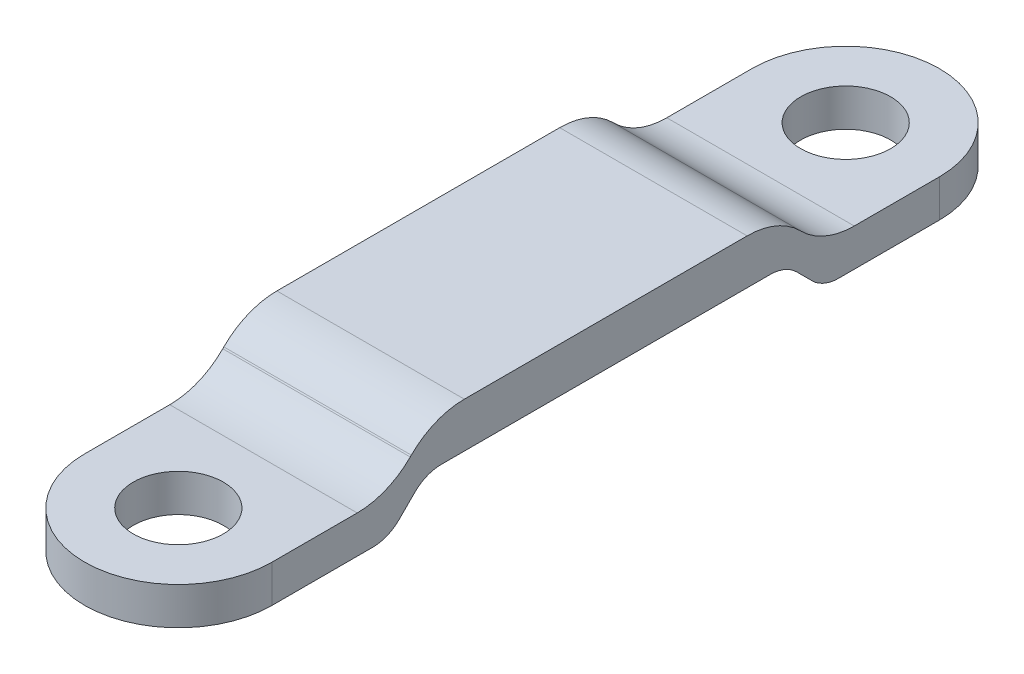
ISO-10303-21;
HEADER;
FILE_DESCRIPTION(('STEP AP214'),'2;1');
FILE_NAME('part.step','',(''),(''),'','','');
FILE_SCHEMA(('AUTOMOTIVE_DESIGN { 1 0 10303 214 1 1 1 1 }'));
ENDSEC;
DATA;
#1=APPLICATION_CONTEXT('core data for automotive mechanical design processes');
#2=APPLICATION_PROTOCOL_DEFINITION('international standard','automotive_design',2000,#1);
#3=PRODUCT_CONTEXT('',#1,'mechanical');
#4=PRODUCT('Part','Part','',(#3));
#5=PRODUCT_RELATED_PRODUCT_CATEGORY('part','',(#4));
#6=PRODUCT_DEFINITION_FORMATION('','',#4);
#7=PRODUCT_DEFINITION_CONTEXT('part definition',#1,'design');
#8=PRODUCT_DEFINITION('design','',#6,#7);
#9=PRODUCT_DEFINITION_SHAPE('','',#8);
#10=(LENGTH_UNIT() NAMED_UNIT(*) SI_UNIT(.MILLI.,.METRE.));
#11=(NAMED_UNIT(*) PLANE_ANGLE_UNIT() SI_UNIT($,.RADIAN.));
#12=(NAMED_UNIT(*) SI_UNIT($,.STERADIAN.) SOLID_ANGLE_UNIT());
#13=UNCERTAINTY_MEASURE_WITH_UNIT(LENGTH_MEASURE(1.E-05),#10,'distance_accuracy_value','');
#14=(GEOMETRIC_REPRESENTATION_CONTEXT(3) GLOBAL_UNCERTAINTY_ASSIGNED_CONTEXT((#13)) GLOBAL_UNIT_ASSIGNED_CONTEXT((#10,
#11,#12)) REPRESENTATION_CONTEXT('',''));
#15=CARTESIAN_POINT('',(0.,0.,0.));
#16=DIRECTION('',(0.,0.,1.));
#17=DIRECTION('',(1.,0.,0.));
#18=AXIS2_PLACEMENT_3D('',#15,#16,#17);
#19=CARTESIAN_POINT('',(0.,5.00000000000001,44.5));
#20=DIRECTION('',(0.,1.,0.));
#21=DIRECTION('',(0.,0.,1.));
#22=AXIS2_PLACEMENT_3D('',#19,#20,#21);
#23=CYLINDRICAL_SURFACE('',#22,12.5);
#24=DIRECTION('',(0.,1.,0.));
#25=VECTOR('',#24,1.);
#26=CARTESIAN_POINT('',(12.5,0.,44.5));
#27=LINE('',#26,#25);
#28=CARTESIAN_POINT('',(12.5,5.00000000000001,44.5));
#29=VERTEX_POINT('',#28);
#30=CARTESIAN_POINT('',(12.5,0.,44.5));
#31=VERTEX_POINT('',#30);
#32=EDGE_CURVE('E174',#29,#31,#27,.F.);
#33=ORIENTED_EDGE('',*,*,#32,.F.);
#34=CARTESIAN_POINT('',(0.,5.00000000000001,44.5));
#35=DIRECTION('',(0.,1.,0.));
#36=DIRECTION('',(0.,0.,1.));
#37=AXIS2_PLACEMENT_3D('',#34,#35,#36);
#38=CIRCLE('',#37,12.5);
#39=CARTESIAN_POINT('',(-12.5,5.00000000000001,44.5));
#40=VERTEX_POINT('',#39);
#41=EDGE_CURVE('E43',#40,#29,#38,.T.);
#42=ORIENTED_EDGE('',*,*,#41,.F.);
#43=DIRECTION('',(0.,-1.,0.));
#44=VECTOR('',#43,1.);
#45=CARTESIAN_POINT('',(-12.5,5.00000000000001,44.5));
#46=LINE('',#45,#44);
#47=CARTESIAN_POINT('',(-12.5,0.,44.5));
#48=VERTEX_POINT('',#47);
#49=EDGE_CURVE('E207',#48,#40,#46,.F.);
#50=ORIENTED_EDGE('',*,*,#49,.F.);
#51=CARTESIAN_POINT('',(0.,0.,44.5));
#52=DIRECTION('',(0.,1.,0.));
#53=DIRECTION('',(0.,0.,1.));
#54=AXIS2_PLACEMENT_3D('',#51,#52,#53);
#55=CIRCLE('',#54,12.5);
#56=EDGE_CURVE('E11',#31,#48,#55,.F.);
#57=ORIENTED_EDGE('',*,*,#56,.F.);
#58=EDGE_LOOP('',(#33,#42,#50,#57));
#59=FACE_BOUND('',#58,.T.);
#60=ADVANCED_FACE('F35',(#59),#23,.T.);
#61=CARTESIAN_POINT('',(0.,0.,-44.5));
#62=DIRECTION('',(0.,1.,0.));
#63=DIRECTION('',(0.,0.,1.));
#64=AXIS2_PLACEMENT_3D('',#61,#62,#63);
#65=CYLINDRICAL_SURFACE('',#64,12.5);
#66=DIRECTION('',(0.,-1.,0.));
#67=VECTOR('',#66,1.);
#68=CARTESIAN_POINT('',(12.5,0.,-44.5));
#69=LINE('',#68,#67);
#70=CARTESIAN_POINT('',(12.5,0.,-44.5));
#71=VERTEX_POINT('',#70);
#72=CARTESIAN_POINT('',(12.5,5.,-44.5));
#73=VERTEX_POINT('',#72);
#74=EDGE_CURVE('E191',#71,#73,#69,.F.);
#75=ORIENTED_EDGE('',*,*,#74,.F.);
#76=CARTESIAN_POINT('',(0.,0.,-44.5));
#77=DIRECTION('',(0.,-1.,0.));
#78=DIRECTION('',(0.,0.,-1.));
#79=AXIS2_PLACEMENT_3D('',#76,#77,#78);
#80=CIRCLE('',#79,12.5);
#81=CARTESIAN_POINT('',(-12.5,0.,-44.5));
#82=VERTEX_POINT('',#81);
#83=EDGE_CURVE('E202',#82,#71,#80,.T.);
#84=ORIENTED_EDGE('',*,*,#83,.F.);
#85=DIRECTION('',(0.,1.,0.));
#86=VECTOR('',#85,1.);
#87=CARTESIAN_POINT('',(-12.5,0.,-44.5));
#88=LINE('',#87,#86);
#89=CARTESIAN_POINT('',(-12.5,5.,-44.5));
#90=VERTEX_POINT('',#89);
#91=EDGE_CURVE('E194',#90,#82,#88,.F.);
#92=ORIENTED_EDGE('',*,*,#91,.F.);
#93=CARTESIAN_POINT('',(0.,5.,-44.5));
#94=DIRECTION('',(0.,-1.,0.));
#95=DIRECTION('',(0.,0.,-1.));
#96=AXIS2_PLACEMENT_3D('',#93,#94,#95);
#97=CIRCLE('',#96,12.5);
#98=EDGE_CURVE('E204',#73,#90,#97,.F.);
#99=ORIENTED_EDGE('',*,*,#98,.F.);
#100=EDGE_LOOP('',(#75,#84,#92,#99));
#101=FACE_BOUND('',#100,.T.);
#102=ADVANCED_FACE('F398',(#101),#65,.T.);
#103=CARTESIAN_POINT('',(12.5,0.,0.));
#104=DIRECTION('',(0.,1.,0.));
#105=DIRECTION('',(0.,0.,1.));
#106=AXIS2_PLACEMENT_3D('',#103,#104,#105);
#107=PLANE('',#106);
#108=CARTESIAN_POINT('',(0.,0.,44.5));
#109=DIRECTION('',(0.,1.,0.));
#110=DIRECTION('',(0.,0.,-1.));
#111=AXIS2_PLACEMENT_3D('',#108,#109,#110);
#112=CIRCLE('',#111,6.);
#113=CARTESIAN_POINT('',(0.,0.,38.5));
#114=VERTEX_POINT('',#113);
#115=EDGE_CURVE('E464',#114,#114,#112,.T.);
#116=ORIENTED_EDGE('',*,*,#115,.T.);
#117=EDGE_LOOP('',(#116));
#118=FACE_BOUND('',#117,.T.);
#119=DIRECTION('',(0.,0.,-1.));
#120=VECTOR('',#119,1.);
#121=CARTESIAN_POINT('',(12.5,0.,0.));
#122=LINE('',#121,#120);
#123=CARTESIAN_POINT('',(12.5,0.,31.0710678118655));
#124=VERTEX_POINT('',#123);
#125=EDGE_CURVE('E168',#31,#124,#122,.T.);
#126=ORIENTED_EDGE('',*,*,#125,.F.);
#127=ORIENTED_EDGE('',*,*,#56,.T.);
#128=DIRECTION('',(0.,0.,-1.));
#129=VECTOR('',#128,1.);
#130=CARTESIAN_POINT('',(-12.5,0.,0.));
#131=LINE('',#130,#129);
#132=CARTESIAN_POINT('',(-12.5,0.,31.0710678118655));
#133=VERTEX_POINT('',#132);
#134=EDGE_CURVE('E189',#48,#133,#131,.T.);
#135=ORIENTED_EDGE('',*,*,#134,.T.);
#136=DIRECTION('',(-1.,0.,0.));
#137=VECTOR('',#136,1.);
#138=CARTESIAN_POINT('',(12.5,0.,31.0710678118655));
#139=LINE('',#138,#137);
#140=EDGE_CURVE('E181',#124,#133,#139,.T.);
#141=ORIENTED_EDGE('',*,*,#140,.F.);
#142=EDGE_LOOP('',(#126,#127,#135,#141));
#143=FACE_BOUND('',#142,.T.);
#144=ADVANCED_FACE('F187',(#118,#143),#107,.F.);
#145=CARTESIAN_POINT('',(12.5,5.00000000000001,31.0710678118655));
#146=DIRECTION('',(-1.,0.,0.));
#147=DIRECTION('',(0.,0.,1.));
#148=AXIS2_PLACEMENT_3D('',#145,#146,#147);
#149=CYLINDRICAL_SURFACE('',#148,5.);
#150=CARTESIAN_POINT('',(-12.5,5.00000000000001,31.0710678118655));
#151=DIRECTION('',(1.,0.,0.));
#152=DIRECTION('',(0.,0.,-1.));
#153=AXIS2_PLACEMENT_3D('',#150,#151,#152);
#154=CIRCLE('',#153,5.);
#155=CARTESIAN_POINT('',(-12.5,1.46446609406726,27.5355339059327));
#156=VERTEX_POINT('',#155);
#157=EDGE_CURVE('E227',#133,#156,#154,.T.);
#158=ORIENTED_EDGE('',*,*,#157,.T.);
#159=DIRECTION('',(-1.,0.,0.));
#160=VECTOR('',#159,1.);
#161=CARTESIAN_POINT('',(12.5,1.46446609406726,27.5355339059327));
#162=LINE('',#161,#160);
#163=CARTESIAN_POINT('',(12.5,1.46446609406726,27.5355339059327));
#164=VERTEX_POINT('',#163);
#165=EDGE_CURVE('E183',#164,#156,#162,.T.);
#166=ORIENTED_EDGE('',*,*,#165,.F.);
#167=CARTESIAN_POINT('',(12.5,5.00000000000001,31.0710678118655));
#168=DIRECTION('',(1.,0.,0.));
#169=DIRECTION('',(0.,0.,-1.));
#170=AXIS2_PLACEMENT_3D('',#167,#168,#169);
#171=CIRCLE('',#170,5.);
#172=EDGE_CURVE('E172',#124,#164,#171,.T.);
#173=ORIENTED_EDGE('',*,*,#172,.F.);
#174=ORIENTED_EDGE('',*,*,#140,.T.);
#175=EDGE_LOOP('',(#158,#166,#173,#174));
#176=FACE_BOUND('',#175,.T.);
#177=ADVANCED_FACE('F180',(#176),#149,.T.);
#178=CARTESIAN_POINT('',(12.5,14.5,14.4999999999998));
#179=DIRECTION('',(0.,0.707106781186553,0.707106781186542));
#180=DIRECTION('',(0.,-0.707106781186542,0.707106781186553));
#181=AXIS2_PLACEMENT_3D('',#178,#179,#180);
#182=PLANE('',#181);
#183=DIRECTION('',(0.,0.707106781186542,-0.707106781186553));
#184=VECTOR('',#183,1.);
#185=CARTESIAN_POINT('',(-12.5,14.5,14.4999999999998));
#186=LINE('',#185,#184);
#187=CARTESIAN_POINT('',(-12.5,3.5355339059327,25.4644660940673));
#188=VERTEX_POINT('',#187);
#189=EDGE_CURVE('E230',#156,#188,#186,.T.);
#190=ORIENTED_EDGE('',*,*,#189,.T.);
#191=DIRECTION('',(-1.,0.,0.));
#192=VECTOR('',#191,1.);
#193=CARTESIAN_POINT('',(12.5,3.5355339059327,25.4644660940673));
#194=LINE('',#193,#192);
#195=CARTESIAN_POINT('',(12.5,3.5355339059327,25.4644660940673));
#196=VERTEX_POINT('',#195);
#197=EDGE_CURVE('E196',#196,#188,#194,.T.);
#198=ORIENTED_EDGE('',*,*,#197,.F.);
#199=DIRECTION('',(0.,0.707106781186542,-0.707106781186553));
#200=VECTOR('',#199,1.);
#201=CARTESIAN_POINT('',(12.5,14.5,14.4999999999998));
#202=LINE('',#201,#200);
#203=EDGE_CURVE('E185',#164,#196,#202,.T.);
#204=ORIENTED_EDGE('',*,*,#203,.F.);
#205=ORIENTED_EDGE('',*,*,#165,.T.);
#206=EDGE_LOOP('',(#190,#198,#204,#205));
#207=FACE_BOUND('',#206,.T.);
#208=ADVANCED_FACE('F307',(#207),#182,.F.);
#209=CARTESIAN_POINT('',(12.5,0.,21.9289321881345));
#210=DIRECTION('',(-1.,0.,0.));
#211=DIRECTION('',(0.,0.,1.));
#212=AXIS2_PLACEMENT_3D('',#209,#210,#211);
#213=CYLINDRICAL_SURFACE('',#212,4.99999999999997);
#214=CARTESIAN_POINT('',(-12.5,0.,21.9289321881345));
#215=DIRECTION('',(1.,0.,0.));
#216=DIRECTION('',(0.,0.,-1.));
#217=AXIS2_PLACEMENT_3D('',#214,#215,#216);
#218=CIRCLE('',#217,4.99999999999997);
#219=CARTESIAN_POINT('',(-12.5,4.99999999999994,21.9289321881345));
#220=VERTEX_POINT('',#219);
#221=EDGE_CURVE('E233',#220,#188,#218,.T.);
#222=ORIENTED_EDGE('',*,*,#221,.F.);
#223=DIRECTION('',(-1.,0.,0.));
#224=VECTOR('',#223,1.);
#225=CARTESIAN_POINT('',(12.5,4.99999999999994,21.9289321881345));
#226=LINE('',#225,#224);
#227=CARTESIAN_POINT('',(12.5,4.99999999999994,21.9289321881345));
#228=VERTEX_POINT('',#227);
#229=EDGE_CURVE('E297',#228,#220,#226,.T.);
#230=ORIENTED_EDGE('',*,*,#229,.F.);
#231=CARTESIAN_POINT('',(12.5,0.,21.9289321881345));
#232=DIRECTION('',(1.,0.,0.));
#233=DIRECTION('',(0.,0.,-1.));
#234=AXIS2_PLACEMENT_3D('',#231,#232,#233);
#235=CIRCLE('',#234,4.99999999999997);
#236=EDGE_CURVE('E304',#228,#196,#235,.T.);
#237=ORIENTED_EDGE('',*,*,#236,.T.);
#238=ORIENTED_EDGE('',*,*,#197,.T.);
#239=EDGE_LOOP('',(#222,#230,#237,#238));
#240=FACE_BOUND('',#239,.T.);
#241=ADVANCED_FACE('F302',(#240),#213,.F.);
#242=CARTESIAN_POINT('',(12.5,4.99999999999994,0.));
#243=DIRECTION('',(0.,-1.,0.));
#244=DIRECTION('',(0.,0.,-1.));
#245=AXIS2_PLACEMENT_3D('',#242,#243,#244);
#246=PLANE('',#245);
#247=DIRECTION('',(0.,0.,1.));
#248=VECTOR('',#247,1.);
#249=CARTESIAN_POINT('',(-12.5,4.99999999999994,0.));
#250=LINE('',#249,#248);
#251=CARTESIAN_POINT('',(-12.5,4.99999999999994,-21.9289321881345));
#252=VERTEX_POINT('',#251);
#253=EDGE_CURVE('E236',#252,#220,#250,.T.);
#254=ORIENTED_EDGE('',*,*,#253,.F.);
#255=DIRECTION('',(-1.,0.,0.));
#256=VECTOR('',#255,1.);
#257=CARTESIAN_POINT('',(12.5,4.99999999999994,-21.9289321881345));
#258=LINE('',#257,#256);
#259=CARTESIAN_POINT('',(12.5,4.99999999999994,-21.9289321881345));
#260=VERTEX_POINT('',#259);
#261=EDGE_CURVE('E295',#260,#252,#258,.T.);
#262=ORIENTED_EDGE('',*,*,#261,.F.);
#263=DIRECTION('',(0.,0.,1.));
#264=VECTOR('',#263,1.);
#265=CARTESIAN_POINT('',(12.5,4.99999999999994,0.));
#266=LINE('',#265,#264);
#267=EDGE_CURVE('E317',#260,#228,#266,.T.);
#268=ORIENTED_EDGE('',*,*,#267,.T.);
#269=ORIENTED_EDGE('',*,*,#229,.T.);
#270=EDGE_LOOP('',(#254,#262,#268,#269));
#271=FACE_BOUND('',#270,.T.);
#272=ADVANCED_FACE('F313',(#271),#246,.T.);
#273=CARTESIAN_POINT('',(12.5,0.,-21.9289321881345));
#274=DIRECTION('',(-1.,0.,0.));
#275=DIRECTION('',(0.,0.,1.));
#276=AXIS2_PLACEMENT_3D('',#273,#274,#275);
#277=CYLINDRICAL_SURFACE('',#276,4.99999999999997);
#278=CARTESIAN_POINT('',(-12.5,0.,-21.9289321881345));
#279=DIRECTION('',(1.,0.,0.));
#280=DIRECTION('',(0.,0.,-1.));
#281=AXIS2_PLACEMENT_3D('',#278,#279,#280);
#282=CIRCLE('',#281,4.99999999999997);
#283=CARTESIAN_POINT('',(-12.5,3.53553390593273,-25.4644660940672));
#284=VERTEX_POINT('',#283);
#285=EDGE_CURVE('E239',#252,#284,#282,.F.);
#286=ORIENTED_EDGE('',*,*,#285,.T.);
#287=DIRECTION('',(-1.,0.,0.));
#288=VECTOR('',#287,1.);
#289=CARTESIAN_POINT('',(12.5,3.53553390593273,-25.4644660940672));
#290=LINE('',#289,#288);
#291=CARTESIAN_POINT('',(12.5,3.53553390593273,-25.4644660940672));
#292=VERTEX_POINT('',#291);
#293=EDGE_CURVE('E293',#292,#284,#290,.T.);
#294=ORIENTED_EDGE('',*,*,#293,.F.);
#295=CARTESIAN_POINT('',(12.5,0.,-21.9289321881345));
#296=DIRECTION('',(1.,0.,0.));
#297=DIRECTION('',(0.,0.,-1.));
#298=AXIS2_PLACEMENT_3D('',#295,#296,#297);
#299=CIRCLE('',#298,4.99999999999997);
#300=EDGE_CURVE('E319',#260,#292,#299,.F.);
#301=ORIENTED_EDGE('',*,*,#300,.F.);
#302=ORIENTED_EDGE('',*,*,#261,.T.);
#303=EDGE_LOOP('',(#286,#294,#301,#302));
#304=FACE_BOUND('',#303,.T.);
#305=ADVANCED_FACE('F397',(#304),#277,.F.);
#306=CARTESIAN_POINT('',(12.5,14.5,-14.4999999999998));
#307=DIRECTION('',(0.,-0.707106781186552,0.707106781186543));
#308=DIRECTION('',(0.,-0.707106781186543,-0.707106781186552));
#309=AXIS2_PLACEMENT_3D('',#306,#307,#308);
#310=PLANE('',#309);
#311=DIRECTION('',(0.,0.707106781186543,0.707106781186552));
#312=VECTOR('',#311,1.);
#313=CARTESIAN_POINT('',(-12.5,14.5,-14.4999999999998));
#314=LINE('',#313,#312);
#315=CARTESIAN_POINT('',(-12.5,1.46446609406725,-27.5355339059327));
#316=VERTEX_POINT('',#315);
#317=EDGE_CURVE('E242',#316,#284,#314,.T.);
#318=ORIENTED_EDGE('',*,*,#317,.F.);
#319=DIRECTION('',(-1.,0.,0.));
#320=VECTOR('',#319,1.);
#321=CARTESIAN_POINT('',(12.5,1.46446609406725,-27.5355339059327));
#322=LINE('',#321,#320);
#323=CARTESIAN_POINT('',(12.5,1.46446609406725,-27.5355339059327));
#324=VERTEX_POINT('',#323);
#325=EDGE_CURVE('E291',#324,#316,#322,.T.);
#326=ORIENTED_EDGE('',*,*,#325,.F.);
#327=DIRECTION('',(0.,0.707106781186543,0.707106781186552));
#328=VECTOR('',#327,1.);
#329=CARTESIAN_POINT('',(12.5,14.5,-14.4999999999998));
#330=LINE('',#329,#328);
#331=EDGE_CURVE('E324',#324,#292,#330,.T.);
#332=ORIENTED_EDGE('',*,*,#331,.T.);
#333=ORIENTED_EDGE('',*,*,#293,.T.);
#334=EDGE_LOOP('',(#318,#326,#332,#333));
#335=FACE_BOUND('',#334,.T.);
#336=ADVANCED_FACE('F393',(#335),#310,.T.);
#337=CARTESIAN_POINT('',(12.5,5.,-31.0710678118655));
#338=DIRECTION('',(-1.,0.,0.));
#339=DIRECTION('',(0.,0.,1.));
#340=AXIS2_PLACEMENT_3D('',#337,#338,#339);
#341=CYLINDRICAL_SURFACE('',#340,5.);
#342=CARTESIAN_POINT('',(-12.5,5.,-31.0710678118655));
#343=DIRECTION('',(1.,0.,0.));
#344=DIRECTION('',(0.,0.,-1.));
#345=AXIS2_PLACEMENT_3D('',#342,#343,#344);
#346=CIRCLE('',#345,5.);
#347=CARTESIAN_POINT('',(-12.5,0.,-31.0710678118655));
#348=VERTEX_POINT('',#347);
#349=EDGE_CURVE('E245',#348,#316,#346,.F.);
#350=ORIENTED_EDGE('',*,*,#349,.F.);
#351=DIRECTION('',(-1.,0.,0.));
#352=VECTOR('',#351,1.);
#353=CARTESIAN_POINT('',(12.5,0.,-31.0710678118655));
#354=LINE('',#353,#352);
#355=CARTESIAN_POINT('',(12.5,0.,-31.0710678118655));
#356=VERTEX_POINT('',#355);
#357=EDGE_CURVE('E288',#356,#348,#354,.T.);
#358=ORIENTED_EDGE('',*,*,#357,.F.);
#359=CARTESIAN_POINT('',(12.5,5.,-31.0710678118655));
#360=DIRECTION('',(1.,0.,0.));
#361=DIRECTION('',(0.,0.,-1.));
#362=AXIS2_PLACEMENT_3D('',#359,#360,#361);
#363=CIRCLE('',#362,5.);
#364=EDGE_CURVE('E327',#356,#324,#363,.F.);
#365=ORIENTED_EDGE('',*,*,#364,.T.);
#366=ORIENTED_EDGE('',*,*,#325,.T.);
#367=EDGE_LOOP('',(#350,#358,#365,#366));
#368=FACE_BOUND('',#367,.T.);
#369=ADVANCED_FACE('F390',(#368),#341,.T.);
#370=CARTESIAN_POINT('',(12.5,0.,0.));
#371=DIRECTION('',(0.,-1.,0.));
#372=DIRECTION('',(0.,0.,-1.));
#373=AXIS2_PLACEMENT_3D('',#370,#371,#372);
#374=PLANE('',#373);
#375=CARTESIAN_POINT('',(0.,0.,-44.5));
#376=DIRECTION('',(0.,1.,0.));
#377=DIRECTION('',(0.,0.,1.));
#378=AXIS2_PLACEMENT_3D('',#375,#376,#377);
#379=CIRCLE('',#378,6.);
#380=CARTESIAN_POINT('',(0.,0.,-38.5));
#381=VERTEX_POINT('',#380);
#382=EDGE_CURVE('E228',#381,#381,#379,.T.);
#383=ORIENTED_EDGE('',*,*,#382,.T.);
#384=EDGE_LOOP('',(#383));
#385=FACE_BOUND('',#384,.T.);
#386=DIRECTION('',(0.,0.,1.));
#387=VECTOR('',#386,1.);
#388=CARTESIAN_POINT('',(-12.5,0.,0.));
#389=LINE('',#388,#387);
#390=EDGE_CURVE('E248',#82,#348,#389,.T.);
#391=ORIENTED_EDGE('',*,*,#390,.F.);
#392=ORIENTED_EDGE('',*,*,#83,.T.);
#393=DIRECTION('',(0.,0.,1.));
#394=VECTOR('',#393,1.);
#395=CARTESIAN_POINT('',(12.5,0.,0.));
#396=LINE('',#395,#394);
#397=EDGE_CURVE('E330',#71,#356,#396,.T.);
#398=ORIENTED_EDGE('',*,*,#397,.T.);
#399=ORIENTED_EDGE('',*,*,#357,.T.);
#400=EDGE_LOOP('',(#391,#392,#398,#399));
#401=FACE_BOUND('',#400,.T.);
#402=ADVANCED_FACE('F383',(#385,#401),#374,.T.);
#403=CARTESIAN_POINT('',(12.5,4.99999999999999,0.));
#404=DIRECTION('',(0.,-1.,0.));
#405=DIRECTION('',(0.,0.,-1.));
#406=AXIS2_PLACEMENT_3D('',#403,#404,#405);
#407=PLANE('',#406);
#408=CARTESIAN_POINT('',(0.,5.,-44.5));
#409=DIRECTION('',(0.,1.,0.));
#410=DIRECTION('',(0.,0.,1.));
#411=AXIS2_PLACEMENT_3D('',#408,#409,#410);
#412=CIRCLE('',#411,6.);
#413=CARTESIAN_POINT('',(0.,5.,-38.5));
#414=VERTEX_POINT('',#413);
#415=EDGE_CURVE('E469',#414,#414,#412,.T.);
#416=ORIENTED_EDGE('',*,*,#415,.F.);
#417=EDGE_LOOP('',(#416));
#418=FACE_BOUND('',#417,.T.);
#419=DIRECTION('',(0.,0.,1.));
#420=VECTOR('',#419,1.);
#421=CARTESIAN_POINT('',(12.5,4.99999999999999,0.));
#422=LINE('',#421,#420);
#423=CARTESIAN_POINT('',(12.5,5.,-33.1421356237309));
#424=VERTEX_POINT('',#423);
#425=EDGE_CURVE('E332',#73,#424,#422,.T.);
#426=ORIENTED_EDGE('',*,*,#425,.F.);
#427=ORIENTED_EDGE('',*,*,#98,.T.);
#428=DIRECTION('',(0.,0.,1.));
#429=VECTOR('',#428,1.);
#430=CARTESIAN_POINT('',(-12.5,4.99999999999999,0.));
#431=LINE('',#430,#429);
#432=CARTESIAN_POINT('',(-12.5,5.,-33.1421356237309));
#433=VERTEX_POINT('',#432);
#434=EDGE_CURVE('E250',#90,#433,#431,.T.);
#435=ORIENTED_EDGE('',*,*,#434,.T.);
#436=DIRECTION('',(-1.,0.,0.));
#437=VECTOR('',#436,1.);
#438=CARTESIAN_POINT('',(12.5,5.,-33.1421356237309));
#439=LINE('',#438,#437);
#440=EDGE_CURVE('E285',#424,#433,#439,.T.);
#441=ORIENTED_EDGE('',*,*,#440,.F.);
#442=EDGE_LOOP('',(#426,#427,#435,#441));
#443=FACE_BOUND('',#442,.T.);
#444=ADVANCED_FACE('F378',(#418,#443),#407,.F.);
#445=CARTESIAN_POINT('',(12.5,15.,-33.1421356237309));
#446=DIRECTION('',(-1.,0.,0.));
#447=DIRECTION('',(0.,0.,1.));
#448=AXIS2_PLACEMENT_3D('',#445,#446,#447);
#449=CYLINDRICAL_SURFACE('',#448,10.);
#450=CARTESIAN_POINT('',(-12.5,15.,-33.1421356237309));
#451=DIRECTION('',(1.,0.,0.));
#452=DIRECTION('',(0.,0.,-1.));
#453=AXIS2_PLACEMENT_3D('',#450,#451,#452);
#454=CIRCLE('',#453,10.);
#455=CARTESIAN_POINT('',(-12.5,7.92893218813449,-26.0710678118655));
#456=VERTEX_POINT('',#455);
#457=EDGE_CURVE('E252',#433,#456,#454,.F.);
#458=ORIENTED_EDGE('',*,*,#457,.T.);
#459=DIRECTION('',(-1.,0.,0.));
#460=VECTOR('',#459,1.);
#461=CARTESIAN_POINT('',(12.5,7.92893218813449,-26.0710678118655));
#462=LINE('',#461,#460);
#463=CARTESIAN_POINT('',(12.5,7.92893218813449,-26.0710678118655));
#464=VERTEX_POINT('',#463);
#465=EDGE_CURVE('E282',#464,#456,#462,.T.);
#466=ORIENTED_EDGE('',*,*,#465,.F.);
#467=CARTESIAN_POINT('',(12.5,15.,-33.1421356237309));
#468=DIRECTION('',(1.,0.,0.));
#469=DIRECTION('',(0.,0.,-1.));
#470=AXIS2_PLACEMENT_3D('',#467,#468,#469);
#471=CIRCLE('',#470,10.);
#472=EDGE_CURVE('E334',#424,#464,#471,.F.);
#473=ORIENTED_EDGE('',*,*,#472,.F.);
#474=ORIENTED_EDGE('',*,*,#440,.T.);
#475=EDGE_LOOP('',(#458,#466,#473,#474));
#476=FACE_BOUND('',#475,.T.);
#477=ADVANCED_FACE('F374',(#476),#449,.F.);
#478=CARTESIAN_POINT('',(12.5,17.0000000000003,-16.999999999999));
#479=DIRECTION('',(0.,-0.707106781186573,0.707106781186522));
#480=DIRECTION('',(0.,-0.707106781186522,-0.707106781186573));
#481=AXIS2_PLACEMENT_3D('',#478,#479,#480);
#482=PLANE('',#481);
#483=DIRECTION('',(0.,0.707106781186522,0.707106781186573));
#484=VECTOR('',#483,1.);
#485=CARTESIAN_POINT('',(-12.5,17.0000000000003,-16.999999999999));
#486=LINE('',#485,#484);
#487=CARTESIAN_POINT('',(-12.5,8.0710678118655,-25.9289321881345));
#488=VERTEX_POINT('',#487);
#489=EDGE_CURVE('E254',#456,#488,#486,.T.);
#490=ORIENTED_EDGE('',*,*,#489,.T.);
#491=DIRECTION('',(-1.,0.,0.));
#492=VECTOR('',#491,1.);
#493=CARTESIAN_POINT('',(12.5,8.0710678118655,-25.9289321881345));
#494=LINE('',#493,#492);
#495=CARTESIAN_POINT('',(12.5,8.0710678118655,-25.9289321881345));
#496=VERTEX_POINT('',#495);
#497=EDGE_CURVE('E280',#496,#488,#494,.T.);
#498=ORIENTED_EDGE('',*,*,#497,.F.);
#499=DIRECTION('',(0.,0.707106781186522,0.707106781186573));
#500=VECTOR('',#499,1.);
#501=CARTESIAN_POINT('',(12.5,17.0000000000003,-16.999999999999));
#502=LINE('',#501,#500);
#503=EDGE_CURVE('E336',#464,#496,#502,.T.);
#504=ORIENTED_EDGE('',*,*,#503,.F.);
#505=ORIENTED_EDGE('',*,*,#465,.T.);
#506=EDGE_LOOP('',(#490,#498,#504,#505));
#507=FACE_BOUND('',#506,.T.);
#508=ADVANCED_FACE('F369',(#507),#482,.F.);
#509=CARTESIAN_POINT('',(12.5,0.999999999999992,-18.857864376269));
#510=DIRECTION('',(-1.,0.,0.));
#511=DIRECTION('',(0.,0.,1.));
#512=AXIS2_PLACEMENT_3D('',#509,#510,#511);
#513=CYLINDRICAL_SURFACE('',#512,10.);
#514=CARTESIAN_POINT('',(-12.5,0.999999999999992,-18.857864376269));
#515=DIRECTION('',(1.,0.,0.));
#516=DIRECTION('',(0.,0.,-1.));
#517=AXIS2_PLACEMENT_3D('',#514,#515,#516);
#518=CIRCLE('',#517,10.);
#519=CARTESIAN_POINT('',(-12.5,11.,-18.857864376269));
#520=VERTEX_POINT('',#519);
#521=EDGE_CURVE('E257',#520,#488,#518,.F.);
#522=ORIENTED_EDGE('',*,*,#521,.F.);
#523=DIRECTION('',(-1.,0.,0.));
#524=VECTOR('',#523,1.);
#525=CARTESIAN_POINT('',(12.5,11.,-18.857864376269));
#526=LINE('',#525,#524);
#527=CARTESIAN_POINT('',(12.5,11.,-18.857864376269));
#528=VERTEX_POINT('',#527);
#529=EDGE_CURVE('E278',#528,#520,#526,.T.);
#530=ORIENTED_EDGE('',*,*,#529,.F.);
#531=CARTESIAN_POINT('',(12.5,0.999999999999992,-18.857864376269));
#532=DIRECTION('',(1.,0.,0.));
#533=DIRECTION('',(0.,0.,-1.));
#534=AXIS2_PLACEMENT_3D('',#531,#532,#533);
#535=CIRCLE('',#534,10.);
#536=EDGE_CURVE('E338',#528,#496,#535,.F.);
#537=ORIENTED_EDGE('',*,*,#536,.T.);
#538=ORIENTED_EDGE('',*,*,#497,.T.);
#539=EDGE_LOOP('',(#522,#530,#537,#538));
#540=FACE_BOUND('',#539,.T.);
#541=ADVANCED_FACE('F363',(#540),#513,.T.);
#542=CARTESIAN_POINT('',(12.5,11.,0.));
#543=DIRECTION('',(0.,1.,0.));
#544=DIRECTION('',(0.,0.,1.));
#545=AXIS2_PLACEMENT_3D('',#542,#543,#544);
#546=PLANE('',#545);
#547=DIRECTION('',(0.,0.,-1.));
#548=VECTOR('',#547,1.);
#549=CARTESIAN_POINT('',(-12.5,11.,0.));
#550=LINE('',#549,#548);
#551=CARTESIAN_POINT('',(-12.5,11.,18.857864376269));
#552=VERTEX_POINT('',#551);
#553=EDGE_CURVE('E260',#552,#520,#550,.T.);
#554=ORIENTED_EDGE('',*,*,#553,.F.);
#555=DIRECTION('',(-1.,0.,0.));
#556=VECTOR('',#555,1.);
#557=CARTESIAN_POINT('',(12.5,11.,18.857864376269));
#558=LINE('',#557,#556);
#559=CARTESIAN_POINT('',(12.5,11.,18.857864376269));
#560=VERTEX_POINT('',#559);
#561=EDGE_CURVE('E276',#560,#552,#558,.T.);
#562=ORIENTED_EDGE('',*,*,#561,.F.);
#563=DIRECTION('',(0.,0.,-1.));
#564=VECTOR('',#563,1.);
#565=CARTESIAN_POINT('',(12.5,11.,0.));
#566=LINE('',#565,#564);
#567=EDGE_CURVE('E341',#560,#528,#566,.T.);
#568=ORIENTED_EDGE('',*,*,#567,.T.);
#569=ORIENTED_EDGE('',*,*,#529,.T.);
#570=EDGE_LOOP('',(#554,#562,#568,#569));
#571=FACE_BOUND('',#570,.T.);
#572=ADVANCED_FACE('F359',(#571),#546,.T.);
#573=CARTESIAN_POINT('',(12.5,1.,18.857864376269));
#574=DIRECTION('',(-1.,0.,0.));
#575=DIRECTION('',(0.,0.,1.));
#576=AXIS2_PLACEMENT_3D('',#573,#574,#575);
#577=CYLINDRICAL_SURFACE('',#576,9.99999999999999);
#578=CARTESIAN_POINT('',(-12.5,1.,18.857864376269));
#579=DIRECTION('',(1.,0.,0.));
#580=DIRECTION('',(0.,0.,-1.));
#581=AXIS2_PLACEMENT_3D('',#578,#579,#580);
#582=CIRCLE('',#581,9.99999999999999);
#583=CARTESIAN_POINT('',(-12.5,8.07106781186551,25.9289321881345));
#584=VERTEX_POINT('',#583);
#585=EDGE_CURVE('E263',#552,#584,#582,.T.);
#586=ORIENTED_EDGE('',*,*,#585,.T.);
#587=DIRECTION('',(-1.,0.,0.));
#588=VECTOR('',#587,1.);
#589=CARTESIAN_POINT('',(12.5,8.07106781186551,25.9289321881345));
#590=LINE('',#589,#588);
#591=CARTESIAN_POINT('',(12.5,8.07106781186551,25.9289321881345));
#592=VERTEX_POINT('',#591);
#593=EDGE_CURVE('E274',#592,#584,#590,.T.);
#594=ORIENTED_EDGE('',*,*,#593,.F.);
#595=CARTESIAN_POINT('',(12.5,1.,18.857864376269));
#596=DIRECTION('',(1.,0.,0.));
#597=DIRECTION('',(0.,0.,-1.));
#598=AXIS2_PLACEMENT_3D('',#595,#596,#597);
#599=CIRCLE('',#598,9.99999999999999);
#600=EDGE_CURVE('E344',#560,#592,#599,.T.);
#601=ORIENTED_EDGE('',*,*,#600,.F.);
#602=ORIENTED_EDGE('',*,*,#561,.T.);
#603=EDGE_LOOP('',(#586,#594,#601,#602));
#604=FACE_BOUND('',#603,.T.);
#605=ADVANCED_FACE('F439',(#604),#577,.T.);
#606=CARTESIAN_POINT('',(12.5,17.0000000000004,16.9999999999987));
#607=DIRECTION('',(0.,0.707106781186582,0.707106781186513));
#608=DIRECTION('',(0.,-0.707106781186513,0.707106781186582));
#609=AXIS2_PLACEMENT_3D('',#606,#607,#608);
#610=PLANE('',#609);
#611=DIRECTION('',(0.,0.707106781186513,-0.707106781186582));
#612=VECTOR('',#611,1.);
#613=CARTESIAN_POINT('',(-12.5,17.0000000000004,16.9999999999987));
#614=LINE('',#613,#612);
#615=CARTESIAN_POINT('',(-12.5,7.92893218813449,26.0710678118655));
#616=VERTEX_POINT('',#615);
#617=EDGE_CURVE('E266',#616,#584,#614,.T.);
#618=ORIENTED_EDGE('',*,*,#617,.F.);
#619=DIRECTION('',(-1.,0.,0.));
#620=VECTOR('',#619,1.);
#621=CARTESIAN_POINT('',(12.5,7.92893218813449,26.0710678118655));
#622=LINE('',#621,#620);
#623=CARTESIAN_POINT('',(12.5,7.92893218813449,26.0710678118655));
#624=VERTEX_POINT('',#623);
#625=EDGE_CURVE('E220',#624,#616,#622,.T.);
#626=ORIENTED_EDGE('',*,*,#625,.F.);
#627=DIRECTION('',(0.,0.707106781186513,-0.707106781186582));
#628=VECTOR('',#627,1.);
#629=CARTESIAN_POINT('',(12.5,17.0000000000004,16.9999999999987));
#630=LINE('',#629,#628);
#631=EDGE_CURVE('E222',#624,#592,#630,.T.);
#632=ORIENTED_EDGE('',*,*,#631,.T.);
#633=ORIENTED_EDGE('',*,*,#593,.T.);
#634=EDGE_LOOP('',(#618,#626,#632,#633));
#635=FACE_BOUND('',#634,.T.);
#636=ADVANCED_FACE('F348',(#635),#610,.T.);
#637=CARTESIAN_POINT('',(12.5,15.,33.1421356237309));
#638=DIRECTION('',(-1.,0.,0.));
#639=DIRECTION('',(0.,0.,1.));
#640=AXIS2_PLACEMENT_3D('',#637,#638,#639);
#641=CYLINDRICAL_SURFACE('',#640,9.99999999999999);
#642=CARTESIAN_POINT('',(-12.5,15.,33.1421356237309));
#643=DIRECTION('',(1.,0.,0.));
#644=DIRECTION('',(0.,0.,-1.));
#645=AXIS2_PLACEMENT_3D('',#642,#643,#644);
#646=CIRCLE('',#645,9.99999999999999);
#647=CARTESIAN_POINT('',(-12.5,5.,33.1421356237309));
#648=VERTEX_POINT('',#647);
#649=EDGE_CURVE('E269',#648,#616,#646,.T.);
#650=ORIENTED_EDGE('',*,*,#649,.F.);
#651=DIRECTION('',(-1.,0.,0.));
#652=VECTOR('',#651,1.);
#653=CARTESIAN_POINT('',(12.5,5.,33.1421356237309));
#654=LINE('',#653,#652);
#655=CARTESIAN_POINT('',(12.5,5.,33.1421356237309));
#656=VERTEX_POINT('',#655);
#657=EDGE_CURVE('E218',#656,#648,#654,.T.);
#658=ORIENTED_EDGE('',*,*,#657,.F.);
#659=CARTESIAN_POINT('',(12.5,15.,33.1421356237309));
#660=DIRECTION('',(1.,0.,0.));
#661=DIRECTION('',(0.,0.,-1.));
#662=AXIS2_PLACEMENT_3D('',#659,#660,#661);
#663=CIRCLE('',#662,9.99999999999999);
#664=EDGE_CURVE('E217',#656,#624,#663,.T.);
#665=ORIENTED_EDGE('',*,*,#664,.T.);
#666=ORIENTED_EDGE('',*,*,#625,.T.);
#667=EDGE_LOOP('',(#650,#658,#665,#666));
#668=FACE_BOUND('',#667,.T.);
#669=ADVANCED_FACE('F354',(#668),#641,.F.);
#670=CARTESIAN_POINT('',(12.5,5.,0.));
#671=DIRECTION('',(0.,1.,0.));
#672=DIRECTION('',(0.,0.,1.));
#673=AXIS2_PLACEMENT_3D('',#670,#671,#672);
#674=PLANE('',#673);
#675=CARTESIAN_POINT('',(0.,4.99999999999999,44.5));
#676=DIRECTION('',(0.,1.,0.));
#677=DIRECTION('',(0.,0.,-1.));
#678=AXIS2_PLACEMENT_3D('',#675,#676,#677);
#679=CIRCLE('',#678,6.);
#680=CARTESIAN_POINT('',(0.,4.99999999999999,38.5));
#681=VERTEX_POINT('',#680);
#682=EDGE_CURVE('E467',#681,#681,#679,.T.);
#683=ORIENTED_EDGE('',*,*,#682,.F.);
#684=EDGE_LOOP('',(#683));
#685=FACE_BOUND('',#684,.T.);
#686=DIRECTION('',(0.,0.,-1.));
#687=VECTOR('',#686,1.);
#688=CARTESIAN_POINT('',(-12.5,5.,0.));
#689=LINE('',#688,#687);
#690=EDGE_CURVE('E176',#40,#648,#689,.T.);
#691=ORIENTED_EDGE('',*,*,#690,.F.);
#692=ORIENTED_EDGE('',*,*,#41,.T.);
#693=DIRECTION('',(0.,0.,-1.));
#694=VECTOR('',#693,1.);
#695=CARTESIAN_POINT('',(12.5,5.,0.));
#696=LINE('',#695,#694);
#697=EDGE_CURVE('E212',#29,#656,#696,.T.);
#698=ORIENTED_EDGE('',*,*,#697,.T.);
#699=ORIENTED_EDGE('',*,*,#657,.T.);
#700=EDGE_LOOP('',(#691,#692,#698,#699));
#701=FACE_BOUND('',#700,.T.);
#702=ADVANCED_FACE('F210',(#685,#701),#674,.T.);
#703=CARTESIAN_POINT('',(12.5,0.,0.));
#704=DIRECTION('',(1.,0.,0.));
#705=DIRECTION('',(0.,0.,-1.));
#706=AXIS2_PLACEMENT_3D('',#703,#704,#705);
#707=PLANE('',#706);
#708=ORIENTED_EDGE('',*,*,#697,.F.);
#709=ORIENTED_EDGE('',*,*,#32,.T.);
#710=ORIENTED_EDGE('',*,*,#125,.T.);
#711=ORIENTED_EDGE('',*,*,#172,.T.);
#712=ORIENTED_EDGE('',*,*,#203,.T.);
#713=ORIENTED_EDGE('',*,*,#236,.F.);
#714=ORIENTED_EDGE('',*,*,#267,.F.);
#715=ORIENTED_EDGE('',*,*,#300,.T.);
#716=ORIENTED_EDGE('',*,*,#331,.F.);
#717=ORIENTED_EDGE('',*,*,#364,.F.);
#718=ORIENTED_EDGE('',*,*,#397,.F.);
#719=ORIENTED_EDGE('',*,*,#74,.T.);
#720=ORIENTED_EDGE('',*,*,#425,.T.);
#721=ORIENTED_EDGE('',*,*,#472,.T.);
#722=ORIENTED_EDGE('',*,*,#503,.T.);
#723=ORIENTED_EDGE('',*,*,#536,.F.);
#724=ORIENTED_EDGE('',*,*,#567,.F.);
#725=ORIENTED_EDGE('',*,*,#600,.T.);
#726=ORIENTED_EDGE('',*,*,#631,.F.);
#727=ORIENTED_EDGE('',*,*,#664,.F.);
#728=EDGE_LOOP('',(#708,#709,#710,#711,#712,#713,#714,#715,#716,#717,#718,#719,#720,#721,#722,
#723,#724,#725,#726,#727));
#729=FACE_BOUND('',#728,.T.);
#730=ADVANCED_FACE('F171',(#729),#707,.T.);
#731=CARTESIAN_POINT('',(-12.5,0.,0.));
#732=DIRECTION('',(1.,0.,0.));
#733=DIRECTION('',(0.,0.,-1.));
#734=AXIS2_PLACEMENT_3D('',#731,#732,#733);
#735=PLANE('',#734);
#736=ORIENTED_EDGE('',*,*,#134,.F.);
#737=ORIENTED_EDGE('',*,*,#49,.T.);
#738=ORIENTED_EDGE('',*,*,#690,.T.);
#739=ORIENTED_EDGE('',*,*,#649,.T.);
#740=ORIENTED_EDGE('',*,*,#617,.T.);
#741=ORIENTED_EDGE('',*,*,#585,.F.);
#742=ORIENTED_EDGE('',*,*,#553,.T.);
#743=ORIENTED_EDGE('',*,*,#521,.T.);
#744=ORIENTED_EDGE('',*,*,#489,.F.);
#745=ORIENTED_EDGE('',*,*,#457,.F.);
#746=ORIENTED_EDGE('',*,*,#434,.F.);
#747=ORIENTED_EDGE('',*,*,#91,.T.);
#748=ORIENTED_EDGE('',*,*,#390,.T.);
#749=ORIENTED_EDGE('',*,*,#349,.T.);
#750=ORIENTED_EDGE('',*,*,#317,.T.);
#751=ORIENTED_EDGE('',*,*,#285,.F.);
#752=ORIENTED_EDGE('',*,*,#253,.T.);
#753=ORIENTED_EDGE('',*,*,#221,.T.);
#754=ORIENTED_EDGE('',*,*,#189,.F.);
#755=ORIENTED_EDGE('',*,*,#157,.F.);
#756=EDGE_LOOP('',(#736,#737,#738,#739,#740,#741,#742,#743,#744,#745,#746,#747,#748,#749,#750,
#751,#752,#753,#754,#755));
#757=FACE_BOUND('',#756,.T.);
#758=ADVANCED_FACE('F309',(#757),#735,.F.);
#759=CARTESIAN_POINT('',(0.,0.,-44.5));
#760=DIRECTION('',(0.,1.,0.));
#761=DIRECTION('',(0.,0.,1.));
#762=AXIS2_PLACEMENT_3D('',#759,#760,#761);
#763=CYLINDRICAL_SURFACE('',#762,6.);
#764=ORIENTED_EDGE('',*,*,#382,.F.);
#765=EDGE_LOOP('',(#764));
#766=FACE_BOUND('',#765,.T.);
#767=ORIENTED_EDGE('',*,*,#415,.T.);
#768=EDGE_LOOP('',(#767));
#769=FACE_BOUND('',#768,.T.);
#770=ADVANCED_FACE('F451',(#766,#769),#763,.F.);
#771=CARTESIAN_POINT('',(0.,0.,44.5));
#772=DIRECTION('',(0.,1.,0.));
#773=DIRECTION('',(0.,0.,1.));
#774=AXIS2_PLACEMENT_3D('',#771,#772,#773);
#775=CYLINDRICAL_SURFACE('',#774,6.);
#776=ORIENTED_EDGE('',*,*,#115,.F.);
#777=EDGE_LOOP('',(#776));
#778=FACE_BOUND('',#777,.T.);
#779=ORIENTED_EDGE('',*,*,#682,.T.);
#780=EDGE_LOOP('',(#779));
#781=FACE_BOUND('',#780,.T.);
#782=ADVANCED_FACE('F455',(#778,#781),#775,.F.);
#783=CLOSED_SHELL('',(#60,#102,#144,#177,#208,#241,#272,#305,#336,#369,#402,#444,#477,#508,#541,
#572,#605,#636,#669,#702,#730,#758,#770,#782));
#784=MANIFOLD_SOLID_BREP('B2',#783);
#785=ADVANCED_BREP_SHAPE_REPRESENTATION('',(#18,#784),#14);
#786=SHAPE_DEFINITION_REPRESENTATION(#9,#785);
ENDSEC;
END-ISO-10303-21;
